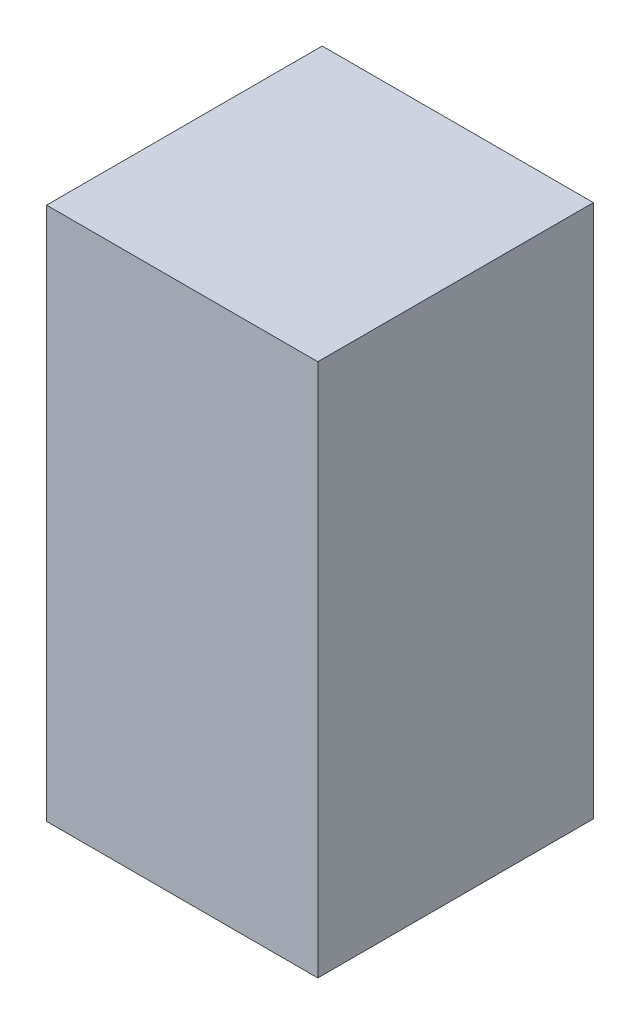
ISO-10303-21;
HEADER;
FILE_DESCRIPTION(('STEP AP214'),'2;1');
FILE_NAME('part.step','',(''),(''),'','','');
FILE_SCHEMA(('AUTOMOTIVE_DESIGN { 1 0 10303 214 1 1 1 1 }'));
ENDSEC;
DATA;
#1=APPLICATION_CONTEXT('core data for automotive mechanical design processes');
#2=APPLICATION_PROTOCOL_DEFINITION('international standard','automotive_design',2000,#1);
#3=PRODUCT_CONTEXT('',#1,'mechanical');
#4=PRODUCT('Part','Part','',(#3));
#5=PRODUCT_RELATED_PRODUCT_CATEGORY('part','',(#4));
#6=PRODUCT_DEFINITION_FORMATION('','',#4);
#7=PRODUCT_DEFINITION_CONTEXT('part definition',#1,'design');
#8=PRODUCT_DEFINITION('design','',#6,#7);
#9=PRODUCT_DEFINITION_SHAPE('','',#8);
#10=(LENGTH_UNIT() NAMED_UNIT(*) SI_UNIT(.MILLI.,.METRE.));
#11=(NAMED_UNIT(*) PLANE_ANGLE_UNIT() SI_UNIT($,.RADIAN.));
#12=(NAMED_UNIT(*) SI_UNIT($,.STERADIAN.) SOLID_ANGLE_UNIT());
#13=UNCERTAINTY_MEASURE_WITH_UNIT(LENGTH_MEASURE(1.E-05),#10,'distance_accuracy_value','');
#14=(GEOMETRIC_REPRESENTATION_CONTEXT(3) GLOBAL_UNCERTAINTY_ASSIGNED_CONTEXT((#13)) GLOBAL_UNIT_ASSIGNED_CONTEXT((#10,
#11,#12)) REPRESENTATION_CONTEXT('',''));
#15=CARTESIAN_POINT('',(0.,0.,0.));
#16=DIRECTION('',(0.,0.,1.));
#17=DIRECTION('',(1.,0.,0.));
#18=AXIS2_PLACEMENT_3D('',#15,#16,#17);
#19=CARTESIAN_POINT('',(0.,0.,31.5));
#20=DIRECTION('',(0.,1.,0.));
#21=DIRECTION('',(0.,0.,1.));
#22=AXIS2_PLACEMENT_3D('',#19,#20,#21);
#23=PLANE('',#22);
#24=DIRECTION('',(1.,0.,0.));
#25=VECTOR('',#24,1.);
#26=CARTESIAN_POINT('',(0.,0.,0.));
#27=LINE('',#26,#25);
#28=CARTESIAN_POINT('',(-31.,0.,0.));
#29=VERTEX_POINT('',#28);
#30=CARTESIAN_POINT('',(0.,0.,0.));
#31=VERTEX_POINT('',#30);
#32=EDGE_CURVE('E113',#29,#31,#27,.T.);
#33=ORIENTED_EDGE('',*,*,#32,.T.);
#34=DIRECTION('',(0.,0.,-1.));
#35=VECTOR('',#34,1.);
#36=CARTESIAN_POINT('',(0.,0.,31.5));
#37=LINE('',#36,#35);
#38=CARTESIAN_POINT('',(0.,0.,31.5));
#39=VERTEX_POINT('',#38);
#40=EDGE_CURVE('E11',#39,#31,#37,.T.);
#41=ORIENTED_EDGE('',*,*,#40,.F.);
#42=DIRECTION('',(1.,0.,0.));
#43=VECTOR('',#42,1.);
#44=CARTESIAN_POINT('',(0.,0.,31.5));
#45=LINE('',#44,#43);
#46=CARTESIAN_POINT('',(-31.,0.,31.5));
#47=VERTEX_POINT('',#46);
#48=EDGE_CURVE('E97',#47,#39,#45,.T.);
#49=ORIENTED_EDGE('',*,*,#48,.F.);
#50=DIRECTION('',(0.,0.,-1.));
#51=VECTOR('',#50,1.);
#52=CARTESIAN_POINT('',(-31.,0.,31.5));
#53=LINE('',#52,#51);
#54=EDGE_CURVE('E109',#47,#29,#53,.T.);
#55=ORIENTED_EDGE('',*,*,#54,.T.);
#56=EDGE_LOOP('',(#33,#41,#49,#55));
#57=FACE_BOUND('',#56,.T.);
#58=ADVANCED_FACE('F45',(#57),#23,.F.);
#59=CARTESIAN_POINT('',(0.,0.,31.5));
#60=DIRECTION('',(-1.,0.,0.));
#61=DIRECTION('',(0.,0.,1.));
#62=AXIS2_PLACEMENT_3D('',#59,#60,#61);
#63=PLANE('',#62);
#64=DIRECTION('',(0.,1.,0.));
#65=VECTOR('',#64,1.);
#66=CARTESIAN_POINT('',(0.,0.,0.));
#67=LINE('',#66,#65);
#68=CARTESIAN_POINT('',(0.,61.,0.));
#69=VERTEX_POINT('',#68);
#70=EDGE_CURVE('E102',#31,#69,#67,.T.);
#71=ORIENTED_EDGE('',*,*,#70,.T.);
#72=DIRECTION('',(0.,0.,-1.));
#73=VECTOR('',#72,1.);
#74=CARTESIAN_POINT('',(0.,61.,31.5));
#75=LINE('',#74,#73);
#76=CARTESIAN_POINT('',(0.,61.,31.5));
#77=VERTEX_POINT('',#76);
#78=EDGE_CURVE('E54',#77,#69,#75,.T.);
#79=ORIENTED_EDGE('',*,*,#78,.F.);
#80=DIRECTION('',(0.,1.,0.));
#81=VECTOR('',#80,1.);
#82=CARTESIAN_POINT('',(0.,0.,31.5));
#83=LINE('',#82,#81);
#84=EDGE_CURVE('E92',#39,#77,#83,.T.);
#85=ORIENTED_EDGE('',*,*,#84,.F.);
#86=ORIENTED_EDGE('',*,*,#40,.T.);
#87=EDGE_LOOP('',(#71,#79,#85,#86));
#88=FACE_BOUND('',#87,.T.);
#89=ADVANCED_FACE('F101',(#88),#63,.F.);
#90=CARTESIAN_POINT('',(0.,61.,31.5));
#91=DIRECTION('',(0.,-1.,0.));
#92=DIRECTION('',(0.,0.,-1.));
#93=AXIS2_PLACEMENT_3D('',#90,#91,#92);
#94=PLANE('',#93);
#95=DIRECTION('',(-1.,0.,0.));
#96=VECTOR('',#95,1.);
#97=CARTESIAN_POINT('',(0.,61.,0.));
#98=LINE('',#97,#96);
#99=CARTESIAN_POINT('',(-31.,61.,0.));
#100=VERTEX_POINT('',#99);
#101=EDGE_CURVE('E79',#69,#100,#98,.T.);
#102=ORIENTED_EDGE('',*,*,#101,.T.);
#103=DIRECTION('',(0.,0.,-1.));
#104=VECTOR('',#103,1.);
#105=CARTESIAN_POINT('',(-31.,61.,31.5));
#106=LINE('',#105,#104);
#107=CARTESIAN_POINT('',(-31.,61.,31.5));
#108=VERTEX_POINT('',#107);
#109=EDGE_CURVE('E104',#108,#100,#106,.T.);
#110=ORIENTED_EDGE('',*,*,#109,.F.);
#111=DIRECTION('',(-1.,0.,0.));
#112=VECTOR('',#111,1.);
#113=CARTESIAN_POINT('',(0.,61.,31.5));
#114=LINE('',#113,#112);
#115=EDGE_CURVE('E95',#77,#108,#114,.T.);
#116=ORIENTED_EDGE('',*,*,#115,.F.);
#117=ORIENTED_EDGE('',*,*,#78,.T.);
#118=EDGE_LOOP('',(#102,#110,#116,#117));
#119=FACE_BOUND('',#118,.T.);
#120=ADVANCED_FACE('F105',(#119),#94,.F.);
#121=CARTESIAN_POINT('',(-31.,0.,31.5));
#122=DIRECTION('',(1.,0.,0.));
#123=DIRECTION('',(0.,0.,-1.));
#124=AXIS2_PLACEMENT_3D('',#121,#122,#123);
#125=PLANE('',#124);
#126=DIRECTION('',(0.,-1.,0.));
#127=VECTOR('',#126,1.);
#128=CARTESIAN_POINT('',(-31.,0.,0.));
#129=LINE('',#128,#127);
#130=EDGE_CURVE('E85',#100,#29,#129,.T.);
#131=ORIENTED_EDGE('',*,*,#130,.T.);
#132=ORIENTED_EDGE('',*,*,#54,.F.);
#133=DIRECTION('',(0.,-1.,0.));
#134=VECTOR('',#133,1.);
#135=CARTESIAN_POINT('',(-31.,0.,31.5));
#136=LINE('',#135,#134);
#137=EDGE_CURVE('E62',#108,#47,#136,.T.);
#138=ORIENTED_EDGE('',*,*,#137,.F.);
#139=ORIENTED_EDGE('',*,*,#109,.T.);
#140=EDGE_LOOP('',(#131,#132,#138,#139));
#141=FACE_BOUND('',#140,.T.);
#142=ADVANCED_FACE('F126',(#141),#125,.F.);
#143=CARTESIAN_POINT('',(0.,0.,31.5));
#144=DIRECTION('',(0.,0.,-1.));
#145=DIRECTION('',(-1.,0.,0.));
#146=AXIS2_PLACEMENT_3D('',#143,#144,#145);
#147=PLANE('',#146);
#148=ORIENTED_EDGE('',*,*,#48,.T.);
#149=ORIENTED_EDGE('',*,*,#84,.T.);
#150=ORIENTED_EDGE('',*,*,#115,.T.);
#151=ORIENTED_EDGE('',*,*,#137,.T.);
#152=EDGE_LOOP('',(#148,#149,#150,#151));
#153=FACE_BOUND('',#152,.T.);
#154=ADVANCED_FACE('F93',(#153),#147,.F.);
#155=CARTESIAN_POINT('',(0.,0.,0.));
#156=DIRECTION('',(0.,0.,-1.));
#157=DIRECTION('',(-1.,0.,0.));
#158=AXIS2_PLACEMENT_3D('',#155,#156,#157);
#159=PLANE('',#158);
#160=ORIENTED_EDGE('',*,*,#32,.F.);
#161=ORIENTED_EDGE('',*,*,#130,.F.);
#162=ORIENTED_EDGE('',*,*,#101,.F.);
#163=ORIENTED_EDGE('',*,*,#70,.F.);
#164=EDGE_LOOP('',(#160,#161,#162,#163));
#165=FACE_BOUND('',#164,.T.);
#166=ADVANCED_FACE('F129',(#165),#159,.T.);
#167=CLOSED_SHELL('',(#58,#89,#120,#142,#154,#166));
#168=MANIFOLD_SOLID_BREP('B2',#167);
#169=ADVANCED_BREP_SHAPE_REPRESENTATION('',(#18,#168),#14);
#170=SHAPE_DEFINITION_REPRESENTATION(#9,#169);
ENDSEC;
END-ISO-10303-21;
